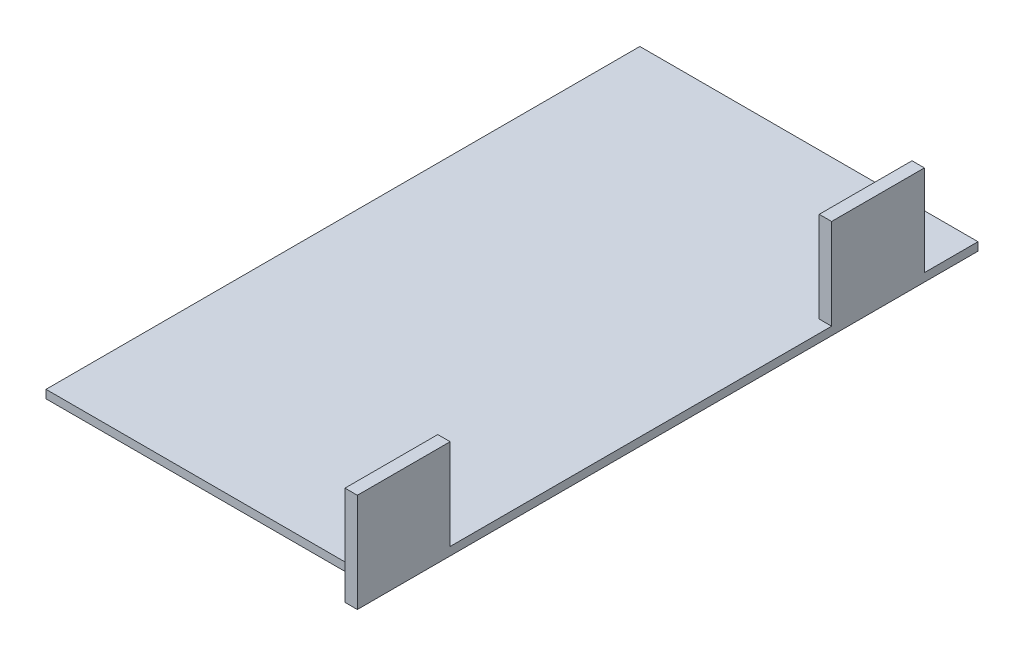
ISO-10303-21;
HEADER;
FILE_DESCRIPTION(('STEP AP214'),'2;1');
FILE_NAME('part.step','',(''),(''),'','','');
FILE_SCHEMA(('AUTOMOTIVE_DESIGN { 1 0 10303 214 1 1 1 1 }'));
ENDSEC;
DATA;
#1=APPLICATION_CONTEXT('core data for automotive mechanical design processes');
#2=APPLICATION_PROTOCOL_DEFINITION('international standard','automotive_design',2000,#1);
#3=PRODUCT_CONTEXT('',#1,'mechanical');
#4=PRODUCT('Part','Part','',(#3));
#5=PRODUCT_RELATED_PRODUCT_CATEGORY('part','',(#4));
#6=PRODUCT_DEFINITION_FORMATION('','',#4);
#7=PRODUCT_DEFINITION_CONTEXT('part definition',#1,'design');
#8=PRODUCT_DEFINITION('design','',#6,#7);
#9=PRODUCT_DEFINITION_SHAPE('','',#8);
#10=(LENGTH_UNIT() NAMED_UNIT(*) SI_UNIT(.MILLI.,.METRE.));
#11=(NAMED_UNIT(*) PLANE_ANGLE_UNIT() SI_UNIT($,.RADIAN.));
#12=(NAMED_UNIT(*) SI_UNIT($,.STERADIAN.) SOLID_ANGLE_UNIT());
#13=UNCERTAINTY_MEASURE_WITH_UNIT(LENGTH_MEASURE(1.E-05),#10,'distance_accuracy_value','');
#14=(GEOMETRIC_REPRESENTATION_CONTEXT(3) GLOBAL_UNCERTAINTY_ASSIGNED_CONTEXT((#13)) GLOBAL_UNIT_ASSIGNED_CONTEXT((#10,
#11,#12)) REPRESENTATION_CONTEXT('',''));
#15=CARTESIAN_POINT('',(0.,0.,0.));
#16=DIRECTION('',(0.,0.,1.));
#17=DIRECTION('',(1.,0.,0.));
#18=AXIS2_PLACEMENT_3D('',#15,#16,#17);
#19=CARTESIAN_POINT('',(41.,2.,-72.));
#20=DIRECTION('',(-1.,0.,0.));
#21=DIRECTION('',(0.,0.,1.));
#22=AXIS2_PLACEMENT_3D('',#19,#20,#21);
#23=PLANE('',#22);
#24=DIRECTION('',(0.,0.,-1.));
#25=VECTOR('',#24,1.);
#26=CARTESIAN_POINT('',(41.,0.,-72.));
#27=LINE('',#26,#25);
#28=CARTESIAN_POINT('',(41.,0.,78.5));
#29=VERTEX_POINT('',#28);
#30=CARTESIAN_POINT('',(41.,0.,-72.));
#31=VERTEX_POINT('',#30);
#32=EDGE_CURVE('E198',#29,#31,#27,.T.);
#33=ORIENTED_EDGE('',*,*,#32,.T.);
#34=DIRECTION('',(0.,-1.,0.));
#35=VECTOR('',#34,1.);
#36=CARTESIAN_POINT('',(41.,2.,-72.));
#37=LINE('',#36,#35);
#38=CARTESIAN_POINT('',(41.,2.,-72.));
#39=VERTEX_POINT('',#38);
#40=EDGE_CURVE('E11',#39,#31,#37,.T.);
#41=ORIENTED_EDGE('',*,*,#40,.F.);
#42=DIRECTION('',(0.,0.,-1.));
#43=VECTOR('',#42,1.);
#44=CARTESIAN_POINT('',(41.,2.,-72.));
#45=LINE('',#44,#43);
#46=CARTESIAN_POINT('',(41.,2.,-59.));
#47=VERTEX_POINT('',#46);
#48=EDGE_CURVE('E202',#47,#39,#45,.T.);
#49=ORIENTED_EDGE('',*,*,#48,.F.);
#50=DIRECTION('',(0.,-1.,0.));
#51=VECTOR('',#50,1.);
#52=CARTESIAN_POINT('',(41.,24.,-59.));
#53=LINE('',#52,#51);
#54=CARTESIAN_POINT('',(41.,24.,-59.));
#55=VERTEX_POINT('',#54);
#56=EDGE_CURVE('E146',#55,#47,#53,.T.);
#57=ORIENTED_EDGE('',*,*,#56,.F.);
#58=DIRECTION('',(0.,0.,1.));
#59=VECTOR('',#58,1.);
#60=CARTESIAN_POINT('',(41.,24.,-59.));
#61=LINE('',#60,#59);
#62=CARTESIAN_POINT('',(41.,24.,-36.5));
#63=VERTEX_POINT('',#62);
#64=EDGE_CURVE('E139',#55,#63,#61,.T.);
#65=ORIENTED_EDGE('',*,*,#64,.T.);
#66=DIRECTION('',(0.,-1.,0.));
#67=VECTOR('',#66,1.);
#68=CARTESIAN_POINT('',(41.,24.,-36.5));
#69=LINE('',#68,#67);
#70=CARTESIAN_POINT('',(41.,2.,-36.5));
#71=VERTEX_POINT('',#70);
#72=EDGE_CURVE('E123',#63,#71,#69,.T.);
#73=ORIENTED_EDGE('',*,*,#72,.T.);
#74=CARTESIAN_POINT('',(41.,2.,56.));
#75=VERTEX_POINT('',#74);
#76=EDGE_CURVE('E199',#75,#71,#45,.T.);
#77=ORIENTED_EDGE('',*,*,#76,.F.);
#78=DIRECTION('',(0.,-1.,0.));
#79=VECTOR('',#78,1.);
#80=CARTESIAN_POINT('',(41.,24.,56.));
#81=LINE('',#80,#79);
#82=CARTESIAN_POINT('',(41.,24.,56.));
#83=VERTEX_POINT('',#82);
#84=EDGE_CURVE('E179',#83,#75,#81,.T.);
#85=ORIENTED_EDGE('',*,*,#84,.F.);
#86=DIRECTION('',(0.,0.,1.));
#87=VECTOR('',#86,1.);
#88=CARTESIAN_POINT('',(41.,24.,56.));
#89=LINE('',#88,#87);
#90=CARTESIAN_POINT('',(41.,24.,78.5));
#91=VERTEX_POINT('',#90);
#92=EDGE_CURVE('E161',#83,#91,#89,.T.);
#93=ORIENTED_EDGE('',*,*,#92,.T.);
#94=DIRECTION('',(0.,-1.,0.));
#95=VECTOR('',#94,1.);
#96=CARTESIAN_POINT('',(41.,24.,78.5));
#97=LINE('',#96,#95);
#98=EDGE_CURVE('E174',#91,#29,#97,.T.);
#99=ORIENTED_EDGE('',*,*,#98,.T.);
#100=EDGE_LOOP('',(#33,#41,#49,#57,#65,#73,#77,#85,#93,#99));
#101=FACE_BOUND('',#100,.T.);
#102=ADVANCED_FACE('F37',(#101),#23,.F.);
#103=CARTESIAN_POINT('',(-41.,2.,-72.));
#104=DIRECTION('',(0.,0.,1.));
#105=DIRECTION('',(1.,0.,0.));
#106=AXIS2_PLACEMENT_3D('',#103,#104,#105);
#107=PLANE('',#106);
#108=DIRECTION('',(-1.,0.,0.));
#109=VECTOR('',#108,1.);
#110=CARTESIAN_POINT('',(-41.,0.,-72.));
#111=LINE('',#110,#109);
#112=CARTESIAN_POINT('',(-41.,0.,-72.));
#113=VERTEX_POINT('',#112);
#114=EDGE_CURVE('E210',#31,#113,#111,.T.);
#115=ORIENTED_EDGE('',*,*,#114,.T.);
#116=DIRECTION('',(0.,-1.,0.));
#117=VECTOR('',#116,1.);
#118=CARTESIAN_POINT('',(-41.,2.,-72.));
#119=LINE('',#118,#117);
#120=CARTESIAN_POINT('',(-41.,2.,-72.));
#121=VERTEX_POINT('',#120);
#122=EDGE_CURVE('E44',#121,#113,#119,.T.);
#123=ORIENTED_EDGE('',*,*,#122,.F.);
#124=DIRECTION('',(-1.,0.,0.));
#125=VECTOR('',#124,1.);
#126=CARTESIAN_POINT('',(-41.,2.,-72.));
#127=LINE('',#126,#125);
#128=EDGE_CURVE('E201',#39,#121,#127,.T.);
#129=ORIENTED_EDGE('',*,*,#128,.F.);
#130=ORIENTED_EDGE('',*,*,#40,.T.);
#131=EDGE_LOOP('',(#115,#123,#129,#130));
#132=FACE_BOUND('',#131,.T.);
#133=ADVANCED_FACE('F250',(#132),#107,.F.);
#134=CARTESIAN_POINT('',(-41.,2.,-72.));
#135=DIRECTION('',(1.,0.,0.));
#136=DIRECTION('',(0.,0.,-1.));
#137=AXIS2_PLACEMENT_3D('',#134,#135,#136);
#138=PLANE('',#137);
#139=DIRECTION('',(0.,0.,1.));
#140=VECTOR('',#139,1.);
#141=CARTESIAN_POINT('',(-41.,0.,-72.));
#142=LINE('',#141,#140);
#143=CARTESIAN_POINT('',(-41.,0.,72.));
#144=VERTEX_POINT('',#143);
#145=EDGE_CURVE('E212',#113,#144,#142,.T.);
#146=ORIENTED_EDGE('',*,*,#145,.T.);
#147=DIRECTION('',(0.,-1.,0.));
#148=VECTOR('',#147,1.);
#149=CARTESIAN_POINT('',(-41.,2.,72.));
#150=LINE('',#149,#148);
#151=CARTESIAN_POINT('',(-41.,2.,72.));
#152=VERTEX_POINT('',#151);
#153=EDGE_CURVE('E208',#152,#144,#150,.T.);
#154=ORIENTED_EDGE('',*,*,#153,.F.);
#155=DIRECTION('',(0.,0.,1.));
#156=VECTOR('',#155,1.);
#157=CARTESIAN_POINT('',(-41.,2.,-72.));
#158=LINE('',#157,#156);
#159=EDGE_CURVE('E204',#121,#152,#158,.T.);
#160=ORIENTED_EDGE('',*,*,#159,.F.);
#161=ORIENTED_EDGE('',*,*,#122,.T.);
#162=EDGE_LOOP('',(#146,#154,#160,#161));
#163=FACE_BOUND('',#162,.T.);
#164=ADVANCED_FACE('F222',(#163),#138,.F.);
#165=CARTESIAN_POINT('',(-41.,2.,72.));
#166=DIRECTION('',(0.,0.,-1.));
#167=DIRECTION('',(-1.,0.,0.));
#168=AXIS2_PLACEMENT_3D('',#165,#166,#167);
#169=PLANE('',#168);
#170=DIRECTION('',(1.,0.,0.));
#171=VECTOR('',#170,1.);
#172=CARTESIAN_POINT('',(-41.,0.,72.));
#173=LINE('',#172,#171);
#174=CARTESIAN_POINT('',(38.,0.,72.));
#175=VERTEX_POINT('',#174);
#176=EDGE_CURVE('E214',#144,#175,#173,.T.);
#177=ORIENTED_EDGE('',*,*,#176,.T.);
#178=DIRECTION('',(0.,1.,0.));
#179=VECTOR('',#178,1.);
#180=CARTESIAN_POINT('',(38.,2.,72.));
#181=LINE('',#180,#179);
#182=CARTESIAN_POINT('',(38.,2.,72.));
#183=VERTEX_POINT('',#182);
#184=EDGE_CURVE('E192',#175,#183,#181,.T.);
#185=ORIENTED_EDGE('',*,*,#184,.T.);
#186=DIRECTION('',(1.,0.,0.));
#187=VECTOR('',#186,1.);
#188=CARTESIAN_POINT('',(-41.,2.,72.));
#189=LINE('',#188,#187);
#190=EDGE_CURVE('E206',#152,#183,#189,.T.);
#191=ORIENTED_EDGE('',*,*,#190,.F.);
#192=ORIENTED_EDGE('',*,*,#153,.T.);
#193=EDGE_LOOP('',(#177,#185,#191,#192));
#194=FACE_BOUND('',#193,.T.);
#195=ADVANCED_FACE('F233',(#194),#169,.F.);
#196=CARTESIAN_POINT('',(0.,2.,0.));
#197=DIRECTION('',(0.,1.,0.));
#198=DIRECTION('',(0.,0.,1.));
#199=AXIS2_PLACEMENT_3D('',#196,#197,#198);
#200=PLANE('',#199);
#201=DIRECTION('',(-1.,0.,0.));
#202=VECTOR('',#201,1.);
#203=CARTESIAN_POINT('',(2.72929826887018E-13,2.,-59.0000000000002));
#204=LINE('',#203,#202);
#205=CARTESIAN_POINT('',(38.,2.,-59.));
#206=VERTEX_POINT('',#205);
#207=EDGE_CURVE('E158',#47,#206,#204,.T.);
#208=ORIENTED_EDGE('',*,*,#207,.F.);
#209=ORIENTED_EDGE('',*,*,#48,.T.);
#210=ORIENTED_EDGE('',*,*,#128,.T.);
#211=ORIENTED_EDGE('',*,*,#159,.T.);
#212=ORIENTED_EDGE('',*,*,#190,.T.);
#213=DIRECTION('',(0.,0.,1.));
#214=VECTOR('',#213,1.);
#215=CARTESIAN_POINT('',(38.,2.,0.));
#216=LINE('',#215,#214);
#217=CARTESIAN_POINT('',(38.,2.,56.));
#218=VERTEX_POINT('',#217);
#219=EDGE_CURVE('E182',#218,#183,#216,.T.);
#220=ORIENTED_EDGE('',*,*,#219,.F.);
#221=DIRECTION('',(-1.,0.,0.));
#222=VECTOR('',#221,1.);
#223=CARTESIAN_POINT('',(0.,2.,56.));
#224=LINE('',#223,#222);
#225=EDGE_CURVE('E195',#75,#218,#224,.T.);
#226=ORIENTED_EDGE('',*,*,#225,.F.);
#227=ORIENTED_EDGE('',*,*,#76,.T.);
#228=DIRECTION('',(1.,0.,0.));
#229=VECTOR('',#228,1.);
#230=CARTESIAN_POINT('',(0.,2.,-36.4999999999999));
#231=LINE('',#230,#229);
#232=CARTESIAN_POINT('',(38.,2.,-36.5));
#233=VERTEX_POINT('',#232);
#234=EDGE_CURVE('E56',#233,#71,#231,.T.);
#235=ORIENTED_EDGE('',*,*,#234,.F.);
#236=DIRECTION('',(0.,0.,1.));
#237=VECTOR('',#236,1.);
#238=CARTESIAN_POINT('',(38.,2.,0.));
#239=LINE('',#238,#237);
#240=EDGE_CURVE('E51',#206,#233,#239,.T.);
#241=ORIENTED_EDGE('',*,*,#240,.F.);
#242=EDGE_LOOP('',(#208,#209,#210,#211,#212,#220,#226,#227,#235,#241));
#243=FACE_BOUND('',#242,.T.);
#244=ADVANCED_FACE('F237',(#243),#200,.T.);
#245=CARTESIAN_POINT('',(0.,0.,0.));
#246=DIRECTION('',(0.,1.,0.));
#247=DIRECTION('',(0.,0.,1.));
#248=AXIS2_PLACEMENT_3D('',#245,#246,#247);
#249=PLANE('',#248);
#250=ORIENTED_EDGE('',*,*,#114,.F.);
#251=ORIENTED_EDGE('',*,*,#32,.F.);
#252=DIRECTION('',(-1.,0.,0.));
#253=VECTOR('',#252,1.);
#254=CARTESIAN_POINT('',(41.,0.,78.5));
#255=LINE('',#254,#253);
#256=CARTESIAN_POINT('',(38.,0.,78.5));
#257=VERTEX_POINT('',#256);
#258=EDGE_CURVE('E160',#29,#257,#255,.T.);
#259=ORIENTED_EDGE('',*,*,#258,.T.);
#260=DIRECTION('',(0.,0.,-1.));
#261=VECTOR('',#260,1.);
#262=CARTESIAN_POINT('',(38.,0.,56.));
#263=LINE('',#262,#261);
#264=EDGE_CURVE('E165',#257,#175,#263,.T.);
#265=ORIENTED_EDGE('',*,*,#264,.T.);
#266=ORIENTED_EDGE('',*,*,#176,.F.);
#267=ORIENTED_EDGE('',*,*,#145,.F.);
#268=EDGE_LOOP('',(#250,#251,#259,#265,#266,#267));
#269=FACE_BOUND('',#268,.T.);
#270=ADVANCED_FACE('F229',(#269),#249,.F.);
#271=CARTESIAN_POINT('',(38.,24.,56.));
#272=DIRECTION('',(-1.,0.,0.));
#273=DIRECTION('',(0.,0.,1.));
#274=AXIS2_PLACEMENT_3D('',#271,#272,#273);
#275=PLANE('',#274);
#276=ORIENTED_EDGE('',*,*,#184,.F.);
#277=ORIENTED_EDGE('',*,*,#264,.F.);
#278=DIRECTION('',(0.,-1.,0.));
#279=VECTOR('',#278,1.);
#280=CARTESIAN_POINT('',(38.,24.,78.5));
#281=LINE('',#280,#279);
#282=CARTESIAN_POINT('',(38.,24.,78.5));
#283=VERTEX_POINT('',#282);
#284=EDGE_CURVE('E186',#283,#257,#281,.T.);
#285=ORIENTED_EDGE('',*,*,#284,.F.);
#286=DIRECTION('',(0.,0.,-1.));
#287=VECTOR('',#286,1.);
#288=CARTESIAN_POINT('',(38.,24.,56.));
#289=LINE('',#288,#287);
#290=CARTESIAN_POINT('',(38.,24.,56.));
#291=VERTEX_POINT('',#290);
#292=EDGE_CURVE('E168',#283,#291,#289,.T.);
#293=ORIENTED_EDGE('',*,*,#292,.T.);
#294=DIRECTION('',(0.,-1.,0.));
#295=VECTOR('',#294,1.);
#296=CARTESIAN_POINT('',(38.,24.,56.));
#297=LINE('',#296,#295);
#298=EDGE_CURVE('E183',#291,#218,#297,.T.);
#299=ORIENTED_EDGE('',*,*,#298,.T.);
#300=ORIENTED_EDGE('',*,*,#219,.T.);
#301=EDGE_LOOP('',(#276,#277,#285,#293,#299,#300));
#302=FACE_BOUND('',#301,.T.);
#303=ADVANCED_FACE('F236',(#302),#275,.T.);
#304=CARTESIAN_POINT('',(41.,24.,56.));
#305=DIRECTION('',(0.,0.,-1.));
#306=DIRECTION('',(-1.,0.,0.));
#307=AXIS2_PLACEMENT_3D('',#304,#305,#306);
#308=PLANE('',#307);
#309=ORIENTED_EDGE('',*,*,#84,.T.);
#310=ORIENTED_EDGE('',*,*,#225,.T.);
#311=ORIENTED_EDGE('',*,*,#298,.F.);
#312=DIRECTION('',(1.,0.,0.));
#313=VECTOR('',#312,1.);
#314=CARTESIAN_POINT('',(41.,24.,56.));
#315=LINE('',#314,#313);
#316=EDGE_CURVE('E171',#291,#83,#315,.T.);
#317=ORIENTED_EDGE('',*,*,#316,.T.);
#318=EDGE_LOOP('',(#309,#310,#311,#317));
#319=FACE_BOUND('',#318,.T.);
#320=ADVANCED_FACE('F239',(#319),#308,.T.);
#321=CARTESIAN_POINT('',(41.,24.,78.5));
#322=DIRECTION('',(0.,0.,1.));
#323=DIRECTION('',(1.,0.,0.));
#324=AXIS2_PLACEMENT_3D('',#321,#322,#323);
#325=PLANE('',#324);
#326=ORIENTED_EDGE('',*,*,#258,.F.);
#327=ORIENTED_EDGE('',*,*,#98,.F.);
#328=DIRECTION('',(-1.,0.,0.));
#329=VECTOR('',#328,1.);
#330=CARTESIAN_POINT('',(41.,24.,78.5));
#331=LINE('',#330,#329);
#332=EDGE_CURVE('E164',#91,#283,#331,.T.);
#333=ORIENTED_EDGE('',*,*,#332,.T.);
#334=ORIENTED_EDGE('',*,*,#284,.T.);
#335=EDGE_LOOP('',(#326,#327,#333,#334));
#336=FACE_BOUND('',#335,.T.);
#337=ADVANCED_FACE('F248',(#336),#325,.T.);
#338=CARTESIAN_POINT('',(0.,24.,0.));
#339=DIRECTION('',(0.,-1.,0.));
#340=DIRECTION('',(0.,0.,-1.));
#341=AXIS2_PLACEMENT_3D('',#338,#339,#340);
#342=PLANE('',#341);
#343=ORIENTED_EDGE('',*,*,#92,.F.);
#344=ORIENTED_EDGE('',*,*,#316,.F.);
#345=ORIENTED_EDGE('',*,*,#292,.F.);
#346=ORIENTED_EDGE('',*,*,#332,.F.);
#347=EDGE_LOOP('',(#343,#344,#345,#346));
#348=FACE_BOUND('',#347,.T.);
#349=ADVANCED_FACE('F244',(#348),#342,.F.);
#350=CARTESIAN_POINT('',(41.,24.,-59.));
#351=DIRECTION('',(0.,0.,-1.));
#352=DIRECTION('',(-1.,0.,0.));
#353=AXIS2_PLACEMENT_3D('',#350,#351,#352);
#354=PLANE('',#353);
#355=ORIENTED_EDGE('',*,*,#56,.T.);
#356=ORIENTED_EDGE('',*,*,#207,.T.);
#357=DIRECTION('',(0.,-1.,0.));
#358=VECTOR('',#357,1.);
#359=CARTESIAN_POINT('',(38.,24.,-59.));
#360=LINE('',#359,#358);
#361=CARTESIAN_POINT('',(38.,24.,-59.));
#362=VERTEX_POINT('',#361);
#363=EDGE_CURVE('E152',#362,#206,#360,.T.);
#364=ORIENTED_EDGE('',*,*,#363,.F.);
#365=DIRECTION('',(1.,0.,0.));
#366=VECTOR('',#365,1.);
#367=CARTESIAN_POINT('',(41.,24.,-59.));
#368=LINE('',#367,#366);
#369=EDGE_CURVE('E132',#362,#55,#368,.T.);
#370=ORIENTED_EDGE('',*,*,#369,.T.);
#371=EDGE_LOOP('',(#355,#356,#364,#370));
#372=FACE_BOUND('',#371,.T.);
#373=ADVANCED_FACE('F252',(#372),#354,.T.);
#374=CARTESIAN_POINT('',(38.,24.,-59.));
#375=DIRECTION('',(-1.,0.,0.));
#376=DIRECTION('',(0.,0.,1.));
#377=AXIS2_PLACEMENT_3D('',#374,#375,#376);
#378=PLANE('',#377);
#379=ORIENTED_EDGE('',*,*,#363,.T.);
#380=ORIENTED_EDGE('',*,*,#240,.T.);
#381=DIRECTION('',(0.,-1.,0.));
#382=VECTOR('',#381,1.);
#383=CARTESIAN_POINT('',(38.,24.,-36.5));
#384=LINE('',#383,#382);
#385=CARTESIAN_POINT('',(38.,24.,-36.5));
#386=VERTEX_POINT('',#385);
#387=EDGE_CURVE('E131',#386,#233,#384,.T.);
#388=ORIENTED_EDGE('',*,*,#387,.F.);
#389=DIRECTION('',(0.,0.,-1.));
#390=VECTOR('',#389,1.);
#391=CARTESIAN_POINT('',(38.,24.,-59.));
#392=LINE('',#391,#390);
#393=EDGE_CURVE('E142',#386,#362,#392,.T.);
#394=ORIENTED_EDGE('',*,*,#393,.T.);
#395=EDGE_LOOP('',(#379,#380,#388,#394));
#396=FACE_BOUND('',#395,.T.);
#397=ADVANCED_FACE('F254',(#396),#378,.T.);
#398=CARTESIAN_POINT('',(41.,24.,-36.5));
#399=DIRECTION('',(0.,0.,1.));
#400=DIRECTION('',(1.,0.,0.));
#401=AXIS2_PLACEMENT_3D('',#398,#399,#400);
#402=PLANE('',#401);
#403=ORIENTED_EDGE('',*,*,#387,.T.);
#404=ORIENTED_EDGE('',*,*,#234,.T.);
#405=ORIENTED_EDGE('',*,*,#72,.F.);
#406=DIRECTION('',(-1.,0.,0.));
#407=VECTOR('',#406,1.);
#408=CARTESIAN_POINT('',(41.,24.,-36.5));
#409=LINE('',#408,#407);
#410=EDGE_CURVE('E127',#63,#386,#409,.T.);
#411=ORIENTED_EDGE('',*,*,#410,.T.);
#412=EDGE_LOOP('',(#403,#404,#405,#411));
#413=FACE_BOUND('',#412,.T.);
#414=ADVANCED_FACE('F126',(#413),#402,.T.);
#415=CARTESIAN_POINT('',(0.,24.,0.));
#416=DIRECTION('',(0.,-1.,0.));
#417=DIRECTION('',(0.,0.,-1.));
#418=AXIS2_PLACEMENT_3D('',#415,#416,#417);
#419=PLANE('',#418);
#420=ORIENTED_EDGE('',*,*,#64,.F.);
#421=ORIENTED_EDGE('',*,*,#369,.F.);
#422=ORIENTED_EDGE('',*,*,#393,.F.);
#423=ORIENTED_EDGE('',*,*,#410,.F.);
#424=EDGE_LOOP('',(#420,#421,#422,#423));
#425=FACE_BOUND('',#424,.T.);
#426=ADVANCED_FACE('F137',(#425),#419,.F.);
#427=CLOSED_SHELL('',(#102,#133,#164,#195,#244,#270,#303,#320,#337,#349,#373,#397,#414,#426));
#428=MANIFOLD_SOLID_BREP('B2',#427);
#429=ADVANCED_BREP_SHAPE_REPRESENTATION('',(#18,#428),#14);
#430=SHAPE_DEFINITION_REPRESENTATION(#9,#429);
ENDSEC;
END-ISO-10303-21;
